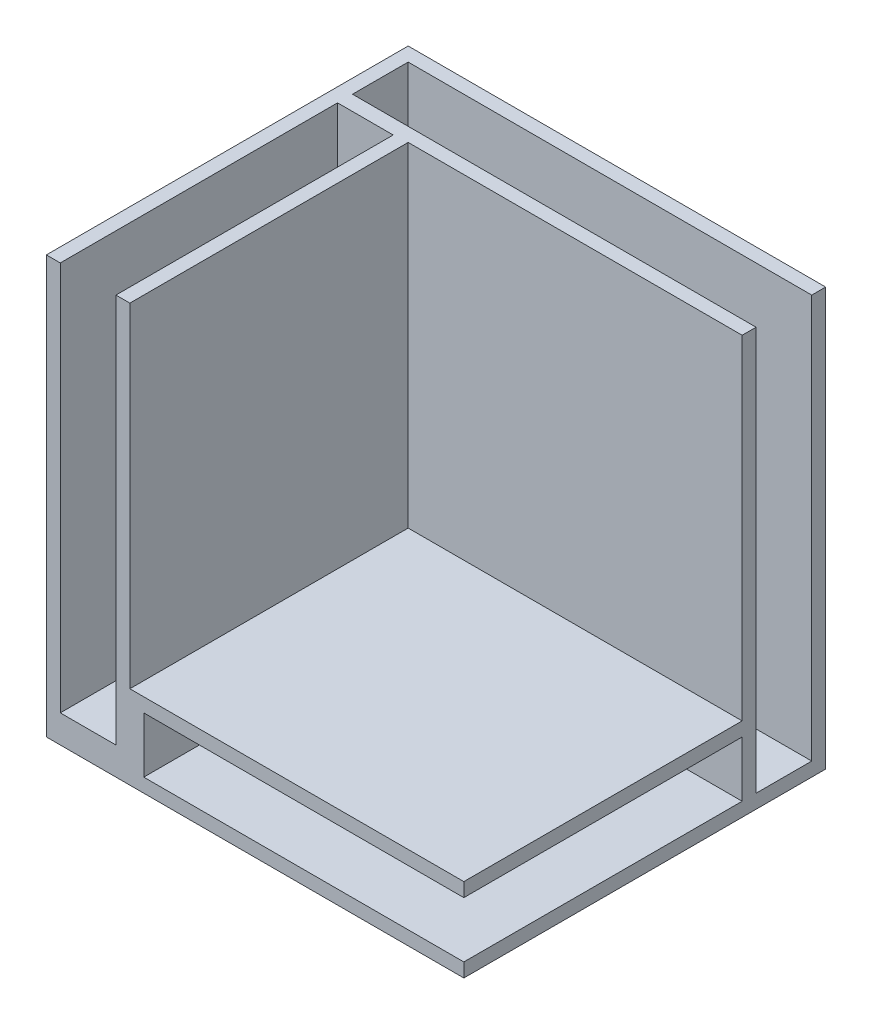
ISO-10303-21;
HEADER;
FILE_DESCRIPTION(('STEP AP214'),'2;1');
FILE_NAME('part.step','',(''),(''),'','','');
FILE_SCHEMA(('AUTOMOTIVE_DESIGN { 1 0 10303 214 1 1 1 1 }'));
ENDSEC;
DATA;
#1=APPLICATION_CONTEXT('core data for automotive mechanical design processes');
#2=APPLICATION_PROTOCOL_DEFINITION('international standard','automotive_design',2000,#1);
#3=PRODUCT_CONTEXT('',#1,'mechanical');
#4=PRODUCT('Part','Part','',(#3));
#5=PRODUCT_RELATED_PRODUCT_CATEGORY('part','',(#4));
#6=PRODUCT_DEFINITION_FORMATION('','',#4);
#7=PRODUCT_DEFINITION_CONTEXT('part definition',#1,'design');
#8=PRODUCT_DEFINITION('design','',#6,#7);
#9=PRODUCT_DEFINITION_SHAPE('','',#8);
#10=(LENGTH_UNIT() NAMED_UNIT(*) SI_UNIT(.MILLI.,.METRE.));
#11=(NAMED_UNIT(*) PLANE_ANGLE_UNIT() SI_UNIT($,.RADIAN.));
#12=(NAMED_UNIT(*) SI_UNIT($,.STERADIAN.) SOLID_ANGLE_UNIT());
#13=UNCERTAINTY_MEASURE_WITH_UNIT(LENGTH_MEASURE(1.E-05),#10,'distance_accuracy_value','');
#14=(GEOMETRIC_REPRESENTATION_CONTEXT(3) GLOBAL_UNCERTAINTY_ASSIGNED_CONTEXT((#13)) GLOBAL_UNIT_ASSIGNED_CONTEXT((#10,
#11,#12)) REPRESENTATION_CONTEXT('',''));
#15=CARTESIAN_POINT('',(0.,0.,0.));
#16=DIRECTION('',(0.,0.,1.));
#17=DIRECTION('',(1.,0.,0.));
#18=AXIS2_PLACEMENT_3D('',#15,#16,#17);
#19=CARTESIAN_POINT('',(5.,0.,26.));
#20=DIRECTION('',(-1.,0.,0.));
#21=DIRECTION('',(0.,0.,1.));
#22=AXIS2_PLACEMENT_3D('',#19,#20,#21);
#23=PLANE('',#22);
#24=DIRECTION('',(0.,1.,0.));
#25=VECTOR('',#24,1.);
#26=CARTESIAN_POINT('',(5.,30.,6.07514362919426));
#27=LINE('',#26,#25);
#28=CARTESIAN_POINT('',(5.,2.,6.07514362919426));
#29=VERTEX_POINT('',#28);
#30=CARTESIAN_POINT('',(5.,30.,6.07514362919426));
#31=VERTEX_POINT('',#30);
#32=EDGE_CURVE('E169',#29,#31,#27,.T.);
#33=ORIENTED_EDGE('',*,*,#32,.F.);
#34=DIRECTION('',(0.,0.,-1.));
#35=VECTOR('',#34,1.);
#36=CARTESIAN_POINT('',(5.,2.,26.));
#37=LINE('',#36,#35);
#38=CARTESIAN_POINT('',(5.,2.,26.));
#39=VERTEX_POINT('',#38);
#40=EDGE_CURVE('E173',#39,#29,#37,.T.);
#41=ORIENTED_EDGE('',*,*,#40,.F.);
#42=DIRECTION('',(0.,1.,0.));
#43=VECTOR('',#42,1.);
#44=CARTESIAN_POINT('',(5.,7.,26.));
#45=LINE('',#44,#43);
#46=CARTESIAN_POINT('',(5.,30.,26.));
#47=VERTEX_POINT('',#46);
#48=EDGE_CURVE('E180',#39,#47,#45,.T.);
#49=ORIENTED_EDGE('',*,*,#48,.T.);
#50=DIRECTION('',(0.,0.,-1.));
#51=VECTOR('',#50,1.);
#52=CARTESIAN_POINT('',(5.,30.,6.));
#53=LINE('',#52,#51);
#54=EDGE_CURVE('E175',#47,#31,#53,.T.);
#55=ORIENTED_EDGE('',*,*,#54,.T.);
#56=EDGE_LOOP('',(#33,#41,#49,#55));
#57=FACE_BOUND('',#56,.T.);
#58=ADVANCED_FACE('F37',(#57),#23,.T.);
#59=CARTESIAN_POINT('',(1.,0.,6.));
#60=DIRECTION('',(1.,0.,0.));
#61=DIRECTION('',(0.,0.,-1.));
#62=AXIS2_PLACEMENT_3D('',#59,#60,#61);
#63=PLANE('',#62);
#64=DIRECTION('',(0.,0.,-1.));
#65=VECTOR('',#64,1.);
#66=CARTESIAN_POINT('',(1.,30.,6.));
#67=LINE('',#66,#65);
#68=CARTESIAN_POINT('',(1.,30.,5.));
#69=VERTEX_POINT('',#68);
#70=CARTESIAN_POINT('',(1.,30.,1.));
#71=VERTEX_POINT('',#70);
#72=EDGE_CURVE('E245',#69,#71,#67,.T.);
#73=ORIENTED_EDGE('',*,*,#72,.F.);
#74=DIRECTION('',(0.,-1.,0.));
#75=VECTOR('',#74,1.);
#76=CARTESIAN_POINT('',(1.,0.,5.));
#77=LINE('',#76,#75);
#78=CARTESIAN_POINT('',(1.,1.,5.));
#79=VERTEX_POINT('',#78);
#80=EDGE_CURVE('E220',#69,#79,#77,.T.);
#81=ORIENTED_EDGE('',*,*,#80,.T.);
#82=DIRECTION('',(0.,0.,-1.));
#83=VECTOR('',#82,1.);
#84=CARTESIAN_POINT('',(1.,1.,6.));
#85=LINE('',#84,#83);
#86=CARTESIAN_POINT('',(1.,1.,1.));
#87=VERTEX_POINT('',#86);
#88=EDGE_CURVE('E231',#79,#87,#85,.T.);
#89=ORIENTED_EDGE('',*,*,#88,.T.);
#90=DIRECTION('',(0.,-1.,0.));
#91=VECTOR('',#90,1.);
#92=CARTESIAN_POINT('',(1.,0.,1.));
#93=LINE('',#92,#91);
#94=EDGE_CURVE('E227',#71,#87,#93,.T.);
#95=ORIENTED_EDGE('',*,*,#94,.F.);
#96=EDGE_LOOP('',(#73,#81,#89,#95));
#97=FACE_BOUND('',#96,.T.);
#98=ADVANCED_FACE('F353',(#97),#63,.T.);
#99=DIRECTION('',(0.,1.,0.));
#100=VECTOR('',#99,1.);
#101=CARTESIAN_POINT('',(1.,0.,6.07514362919426));
#102=LINE('',#101,#100);
#103=CARTESIAN_POINT('',(1.,2.,6.07514362919426));
#104=VERTEX_POINT('',#103);
#105=CARTESIAN_POINT('',(1.,30.,6.07514362919426));
#106=VERTEX_POINT('',#105);
#107=EDGE_CURVE('E11',#104,#106,#102,.T.);
#108=ORIENTED_EDGE('',*,*,#107,.T.);
#109=CARTESIAN_POINT('',(1.,30.,26.));
#110=VERTEX_POINT('',#109);
#111=EDGE_CURVE('E242',#110,#106,#67,.T.);
#112=ORIENTED_EDGE('',*,*,#111,.F.);
#113=DIRECTION('',(0.,-1.,0.));
#114=VECTOR('',#113,1.);
#115=CARTESIAN_POINT('',(1.,7.,26.));
#116=LINE('',#115,#114);
#117=CARTESIAN_POINT('',(1.,2.,26.));
#118=VERTEX_POINT('',#117);
#119=EDGE_CURVE('E206',#110,#118,#116,.T.);
#120=ORIENTED_EDGE('',*,*,#119,.T.);
#121=DIRECTION('',(0.,0.,1.));
#122=VECTOR('',#121,1.);
#123=CARTESIAN_POINT('',(1.,2.,6.07514362919426));
#124=LINE('',#123,#122);
#125=EDGE_CURVE('E188',#104,#118,#124,.T.);
#126=ORIENTED_EDGE('',*,*,#125,.F.);
#127=EDGE_LOOP('',(#108,#112,#120,#126));
#128=FACE_BOUND('',#127,.T.);
#129=ADVANCED_FACE('F374',(#128),#63,.T.);
#130=CARTESIAN_POINT('',(6.,5.,26.));
#131=DIRECTION('',(0.,-1.,0.));
#132=DIRECTION('',(0.,0.,-1.));
#133=AXIS2_PLACEMENT_3D('',#130,#131,#132);
#134=PLANE('',#133);
#135=DIRECTION('',(0.,0.,-1.));
#136=VECTOR('',#135,1.);
#137=CARTESIAN_POINT('',(7.,5.,26.));
#138=LINE('',#137,#136);
#139=CARTESIAN_POINT('',(7.,5.,26.));
#140=VERTEX_POINT('',#139);
#141=CARTESIAN_POINT('',(7.,5.,6.));
#142=VERTEX_POINT('',#141);
#143=EDGE_CURVE('E240',#140,#142,#138,.T.);
#144=ORIENTED_EDGE('',*,*,#143,.T.);
#145=DIRECTION('',(-1.,0.,0.));
#146=VECTOR('',#145,1.);
#147=CARTESIAN_POINT('',(30.,5.,6.));
#148=LINE('',#147,#146);
#149=CARTESIAN_POINT('',(30.,5.,6.));
#150=VERTEX_POINT('',#149);
#151=EDGE_CURVE('E210',#150,#142,#148,.T.);
#152=ORIENTED_EDGE('',*,*,#151,.F.);
#153=DIRECTION('',(0.,0.,-1.));
#154=VECTOR('',#153,1.);
#155=CARTESIAN_POINT('',(30.,5.,26.));
#156=LINE('',#155,#154);
#157=CARTESIAN_POINT('',(30.,5.,26.));
#158=VERTEX_POINT('',#157);
#159=EDGE_CURVE('E219',#158,#150,#156,.T.);
#160=ORIENTED_EDGE('',*,*,#159,.F.);
#161=DIRECTION('',(-1.,0.,0.));
#162=VECTOR('',#161,1.);
#163=CARTESIAN_POINT('',(7.,5.,26.));
#164=LINE('',#163,#162);
#165=EDGE_CURVE('E203',#158,#140,#164,.T.);
#166=ORIENTED_EDGE('',*,*,#165,.T.);
#167=EDGE_LOOP('',(#144,#152,#160,#166));
#168=FACE_BOUND('',#167,.T.);
#169=ADVANCED_FACE('F328',(#168),#134,.T.);
#170=CARTESIAN_POINT('',(0.,1.,6.));
#171=DIRECTION('',(0.,1.,0.));
#172=DIRECTION('',(0.,0.,1.));
#173=AXIS2_PLACEMENT_3D('',#170,#171,#172);
#174=PLANE('',#173);
#175=DIRECTION('',(0.,0.,-1.));
#176=VECTOR('',#175,1.);
#177=CARTESIAN_POINT('',(30.,1.,6.));
#178=LINE('',#177,#176);
#179=CARTESIAN_POINT('',(30.,1.,26.));
#180=VERTEX_POINT('',#179);
#181=CARTESIAN_POINT('',(30.,1.,6.));
#182=VERTEX_POINT('',#181);
#183=EDGE_CURVE('E234',#180,#182,#178,.T.);
#184=ORIENTED_EDGE('',*,*,#183,.T.);
#185=DIRECTION('',(-1.,0.,0.));
#186=VECTOR('',#185,1.);
#187=CARTESIAN_POINT('',(0.,1.,6.));
#188=LINE('',#187,#186);
#189=CARTESIAN_POINT('',(7.,1.,6.));
#190=VERTEX_POINT('',#189);
#191=EDGE_CURVE('E216',#182,#190,#188,.T.);
#192=ORIENTED_EDGE('',*,*,#191,.T.);
#193=DIRECTION('',(0.,0.,-1.));
#194=VECTOR('',#193,1.);
#195=CARTESIAN_POINT('',(7.,1.,6.));
#196=LINE('',#195,#194);
#197=CARTESIAN_POINT('',(7.,1.,26.));
#198=VERTEX_POINT('',#197);
#199=EDGE_CURVE('E238',#198,#190,#196,.T.);
#200=ORIENTED_EDGE('',*,*,#199,.F.);
#201=DIRECTION('',(1.,0.,0.));
#202=VECTOR('',#201,1.);
#203=CARTESIAN_POINT('',(7.,1.,26.));
#204=LINE('',#203,#202);
#205=EDGE_CURVE('E200',#198,#180,#204,.T.);
#206=ORIENTED_EDGE('',*,*,#205,.T.);
#207=EDGE_LOOP('',(#184,#192,#200,#206));
#208=FACE_BOUND('',#207,.T.);
#209=ADVANCED_FACE('F321',(#208),#174,.T.);
#210=DIRECTION('',(1.,0.,0.));
#211=VECTOR('',#210,1.);
#212=CARTESIAN_POINT('',(0.,1.,5.));
#213=LINE('',#212,#211);
#214=CARTESIAN_POINT('',(30.,1.,5.));
#215=VERTEX_POINT('',#214);
#216=EDGE_CURVE('E222',#79,#215,#213,.T.);
#217=ORIENTED_EDGE('',*,*,#216,.T.);
#218=CARTESIAN_POINT('',(30.,1.,1.));
#219=VERTEX_POINT('',#218);
#220=EDGE_CURVE('E244',#215,#219,#178,.T.);
#221=ORIENTED_EDGE('',*,*,#220,.T.);
#222=DIRECTION('',(1.,0.,0.));
#223=VECTOR('',#222,1.);
#224=CARTESIAN_POINT('',(0.,1.,1.));
#225=LINE('',#224,#223);
#226=EDGE_CURVE('E230',#87,#219,#225,.T.);
#227=ORIENTED_EDGE('',*,*,#226,.F.);
#228=ORIENTED_EDGE('',*,*,#88,.F.);
#229=EDGE_LOOP('',(#217,#221,#227,#228));
#230=FACE_BOUND('',#229,.T.);
#231=ADVANCED_FACE('F357',(#230),#174,.T.);
#232=CARTESIAN_POINT('',(7.,6.,26.));
#233=DIRECTION('',(1.,0.,0.));
#234=DIRECTION('',(0.,1.,0.));
#235=AXIS2_PLACEMENT_3D('',#232,#233,#234);
#236=PLANE('',#235);
#237=ORIENTED_EDGE('',*,*,#199,.T.);
#238=DIRECTION('',(0.,1.,0.));
#239=VECTOR('',#238,1.);
#240=CARTESIAN_POINT('',(7.,6.,6.));
#241=LINE('',#240,#239);
#242=EDGE_CURVE('E45',#190,#142,#241,.T.);
#243=ORIENTED_EDGE('',*,*,#242,.T.);
#244=ORIENTED_EDGE('',*,*,#143,.F.);
#245=DIRECTION('',(0.,-1.,0.));
#246=VECTOR('',#245,1.);
#247=CARTESIAN_POINT('',(7.,5.,26.));
#248=LINE('',#247,#246);
#249=EDGE_CURVE('E197',#140,#198,#248,.T.);
#250=ORIENTED_EDGE('',*,*,#249,.T.);
#251=EDGE_LOOP('',(#237,#243,#244,#250));
#252=FACE_BOUND('',#251,.T.);
#253=ADVANCED_FACE('F314',(#252),#236,.T.);
#254=CARTESIAN_POINT('',(30.,0.,6.));
#255=DIRECTION('',(-1.,0.,0.));
#256=DIRECTION('',(0.,0.,1.));
#257=AXIS2_PLACEMENT_3D('',#254,#255,#256);
#258=PLANE('',#257);
#259=DIRECTION('',(0.,1.,0.));
#260=VECTOR('',#259,1.);
#261=CARTESIAN_POINT('',(30.,6.,26.));
#262=LINE('',#261,#260);
#263=CARTESIAN_POINT('',(30.,6.,26.));
#264=VERTEX_POINT('',#263);
#265=EDGE_CURVE('E258',#158,#264,#262,.T.);
#266=ORIENTED_EDGE('',*,*,#265,.F.);
#267=ORIENTED_EDGE('',*,*,#159,.T.);
#268=DIRECTION('',(0.,1.,0.));
#269=VECTOR('',#268,1.);
#270=CARTESIAN_POINT('',(30.,0.,6.));
#271=LINE('',#270,#269);
#272=EDGE_CURVE('E213',#182,#150,#271,.T.);
#273=ORIENTED_EDGE('',*,*,#272,.F.);
#274=ORIENTED_EDGE('',*,*,#183,.F.);
#275=CARTESIAN_POINT('',(30.,0.,26.));
#276=VERTEX_POINT('',#275);
#277=EDGE_CURVE('E259',#276,#180,#262,.T.);
#278=ORIENTED_EDGE('',*,*,#277,.F.);
#279=DIRECTION('',(0.,0.,-1.));
#280=VECTOR('',#279,1.);
#281=CARTESIAN_POINT('',(30.,0.,6.));
#282=LINE('',#281,#280);
#283=CARTESIAN_POINT('',(30.,0.,0.));
#284=VERTEX_POINT('',#283);
#285=EDGE_CURVE('E307',#276,#284,#282,.T.);
#286=ORIENTED_EDGE('',*,*,#285,.T.);
#287=DIRECTION('',(0.,1.,0.));
#288=VECTOR('',#287,1.);
#289=CARTESIAN_POINT('',(30.,0.,0.));
#290=LINE('',#289,#288);
#291=CARTESIAN_POINT('',(30.,30.,0.));
#292=VERTEX_POINT('',#291);
#293=EDGE_CURVE('E298',#284,#292,#290,.T.);
#294=ORIENTED_EDGE('',*,*,#293,.T.);
#295=DIRECTION('',(0.,0.,-1.));
#296=VECTOR('',#295,1.);
#297=CARTESIAN_POINT('',(30.,30.,6.));
#298=LINE('',#297,#296);
#299=CARTESIAN_POINT('',(30.,30.,1.));
#300=VERTEX_POINT('',#299);
#301=EDGE_CURVE('E304',#300,#292,#298,.T.);
#302=ORIENTED_EDGE('',*,*,#301,.F.);
#303=DIRECTION('',(0.,1.,0.));
#304=VECTOR('',#303,1.);
#305=CARTESIAN_POINT('',(30.,0.,1.));
#306=LINE('',#305,#304);
#307=EDGE_CURVE('E237',#219,#300,#306,.T.);
#308=ORIENTED_EDGE('',*,*,#307,.F.);
#309=ORIENTED_EDGE('',*,*,#220,.F.);
#310=DIRECTION('',(0.,1.,0.));
#311=VECTOR('',#310,1.);
#312=CARTESIAN_POINT('',(30.,0.,5.));
#313=LINE('',#312,#311);
#314=CARTESIAN_POINT('',(30.,30.,5.));
#315=VERTEX_POINT('',#314);
#316=EDGE_CURVE('E226',#215,#315,#313,.T.);
#317=ORIENTED_EDGE('',*,*,#316,.T.);
#318=CARTESIAN_POINT('',(30.,30.,6.));
#319=VERTEX_POINT('',#318);
#320=EDGE_CURVE('E305',#319,#315,#298,.T.);
#321=ORIENTED_EDGE('',*,*,#320,.F.);
#322=DIRECTION('',(0.,1.,0.));
#323=VECTOR('',#322,1.);
#324=CARTESIAN_POINT('',(30.,0.,6.));
#325=LINE('',#324,#323);
#326=CARTESIAN_POINT('',(30.,6.,6.));
#327=VERTEX_POINT('',#326);
#328=EDGE_CURVE('E286',#327,#319,#325,.T.);
#329=ORIENTED_EDGE('',*,*,#328,.F.);
#330=DIRECTION('',(0.,0.,-1.));
#331=VECTOR('',#330,1.);
#332=CARTESIAN_POINT('',(30.,6.,26.));
#333=LINE('',#332,#331);
#334=EDGE_CURVE('E268',#264,#327,#333,.T.);
#335=ORIENTED_EDGE('',*,*,#334,.F.);
#336=EDGE_LOOP('',(#266,#267,#273,#274,#278,#286,#294,#302,#308,#309,#317,#321,#329,#335));
#337=FACE_BOUND('',#336,.T.);
#338=ADVANCED_FACE('F326',(#337),#258,.F.);
#339=CARTESIAN_POINT('',(0.,30.,6.));
#340=DIRECTION('',(0.,-1.,0.));
#341=DIRECTION('',(0.,0.,-1.));
#342=AXIS2_PLACEMENT_3D('',#339,#340,#341);
#343=PLANE('',#342);
#344=DIRECTION('',(-1.,0.,0.));
#345=VECTOR('',#344,1.);
#346=CARTESIAN_POINT('',(0.,30.,26.));
#347=LINE('',#346,#345);
#348=CARTESIAN_POINT('',(0.,30.,26.));
#349=VERTEX_POINT('',#348);
#350=EDGE_CURVE('E274',#110,#349,#347,.T.);
#351=ORIENTED_EDGE('',*,*,#350,.F.);
#352=ORIENTED_EDGE('',*,*,#111,.T.);
#353=DIRECTION('',(1.,0.,0.));
#354=VECTOR('',#353,1.);
#355=CARTESIAN_POINT('',(0.,30.,6.07514362919426));
#356=LINE('',#355,#354);
#357=EDGE_CURVE('E179',#106,#31,#356,.T.);
#358=ORIENTED_EDGE('',*,*,#357,.T.);
#359=ORIENTED_EDGE('',*,*,#54,.F.);
#360=CARTESIAN_POINT('',(6.,30.,26.));
#361=VERTEX_POINT('',#360);
#362=EDGE_CURVE('E275',#361,#47,#347,.T.);
#363=ORIENTED_EDGE('',*,*,#362,.F.);
#364=DIRECTION('',(0.,0.,-1.));
#365=VECTOR('',#364,1.);
#366=CARTESIAN_POINT('',(6.,30.,26.));
#367=LINE('',#366,#365);
#368=CARTESIAN_POINT('',(6.,30.,6.));
#369=VERTEX_POINT('',#368);
#370=EDGE_CURVE('E281',#361,#369,#367,.T.);
#371=ORIENTED_EDGE('',*,*,#370,.T.);
#372=DIRECTION('',(-1.,0.,0.));
#373=VECTOR('',#372,1.);
#374=CARTESIAN_POINT('',(0.,30.,6.));
#375=LINE('',#374,#373);
#376=EDGE_CURVE('E288',#319,#369,#375,.T.);
#377=ORIENTED_EDGE('',*,*,#376,.F.);
#378=ORIENTED_EDGE('',*,*,#320,.T.);
#379=DIRECTION('',(-1.,0.,0.));
#380=VECTOR('',#379,1.);
#381=CARTESIAN_POINT('',(0.,30.,5.));
#382=LINE('',#381,#380);
#383=EDGE_CURVE('E52',#315,#69,#382,.T.);
#384=ORIENTED_EDGE('',*,*,#383,.T.);
#385=ORIENTED_EDGE('',*,*,#72,.T.);
#386=DIRECTION('',(-1.,0.,0.));
#387=VECTOR('',#386,1.);
#388=CARTESIAN_POINT('',(0.,30.,1.));
#389=LINE('',#388,#387);
#390=EDGE_CURVE('E223',#300,#71,#389,.T.);
#391=ORIENTED_EDGE('',*,*,#390,.F.);
#392=ORIENTED_EDGE('',*,*,#301,.T.);
#393=DIRECTION('',(-1.,0.,0.));
#394=VECTOR('',#393,1.);
#395=CARTESIAN_POINT('',(0.,30.,0.));
#396=LINE('',#395,#394);
#397=CARTESIAN_POINT('',(0.,30.,0.));
#398=VERTEX_POINT('',#397);
#399=EDGE_CURVE('E289',#292,#398,#396,.T.);
#400=ORIENTED_EDGE('',*,*,#399,.T.);
#401=DIRECTION('',(0.,0.,-1.));
#402=VECTOR('',#401,1.);
#403=CARTESIAN_POINT('',(0.,30.,6.));
#404=LINE('',#403,#402);
#405=EDGE_CURVE('E292',#349,#398,#404,.T.);
#406=ORIENTED_EDGE('',*,*,#405,.F.);
#407=EDGE_LOOP('',(#351,#352,#358,#359,#363,#371,#377,#378,#384,#385,#391,#392,#400,#406));
#408=FACE_BOUND('',#407,.T.);
#409=ADVANCED_FACE('F346',(#408),#343,.F.);
#410=CARTESIAN_POINT('',(0.,0.,6.));
#411=DIRECTION('',(0.,0.,-1.));
#412=DIRECTION('',(-1.,0.,0.));
#413=AXIS2_PLACEMENT_3D('',#410,#411,#412);
#414=PLANE('',#413);
#415=DIRECTION('',(-1.,0.,0.));
#416=VECTOR('',#415,1.);
#417=CARTESIAN_POINT('',(6.,6.,6.));
#418=LINE('',#417,#416);
#419=CARTESIAN_POINT('',(6.,6.,6.));
#420=VERTEX_POINT('',#419);
#421=EDGE_CURVE('E60',#327,#420,#418,.T.);
#422=ORIENTED_EDGE('',*,*,#421,.F.);
#423=ORIENTED_EDGE('',*,*,#328,.T.);
#424=ORIENTED_EDGE('',*,*,#376,.T.);
#425=DIRECTION('',(0.,1.,0.));
#426=VECTOR('',#425,1.);
#427=CARTESIAN_POINT('',(6.,0.,6.));
#428=LINE('',#427,#426);
#429=EDGE_CURVE('E271',#420,#369,#428,.T.);
#430=ORIENTED_EDGE('',*,*,#429,.F.);
#431=EDGE_LOOP('',(#422,#423,#424,#430));
#432=FACE_BOUND('',#431,.T.);
#433=ADVANCED_FACE('F364',(#432),#414,.F.);
#434=CARTESIAN_POINT('',(6.,0.,26.));
#435=DIRECTION('',(-1.,0.,0.));
#436=DIRECTION('',(0.,0.,1.));
#437=AXIS2_PLACEMENT_3D('',#434,#435,#436);
#438=PLANE('',#437);
#439=DIRECTION('',(0.,0.,-1.));
#440=VECTOR('',#439,1.);
#441=CARTESIAN_POINT('',(6.,6.,26.));
#442=LINE('',#441,#440);
#443=CARTESIAN_POINT('',(6.,6.,26.));
#444=VERTEX_POINT('',#443);
#445=EDGE_CURVE('E265',#444,#420,#442,.T.);
#446=ORIENTED_EDGE('',*,*,#445,.T.);
#447=ORIENTED_EDGE('',*,*,#429,.T.);
#448=ORIENTED_EDGE('',*,*,#370,.F.);
#449=DIRECTION('',(0.,1.,0.));
#450=VECTOR('',#449,1.);
#451=CARTESIAN_POINT('',(6.,0.,26.));
#452=LINE('',#451,#450);
#453=EDGE_CURVE('E272',#444,#361,#452,.T.);
#454=ORIENTED_EDGE('',*,*,#453,.F.);
#455=EDGE_LOOP('',(#446,#447,#448,#454));
#456=FACE_BOUND('',#455,.T.);
#457=ADVANCED_FACE('F371',(#456),#438,.F.);
#458=CARTESIAN_POINT('',(0.,0.,6.));
#459=DIRECTION('',(1.,0.,0.));
#460=DIRECTION('',(0.,0.,-1.));
#461=AXIS2_PLACEMENT_3D('',#458,#459,#460);
#462=PLANE('',#461);
#463=ORIENTED_EDGE('',*,*,#405,.T.);
#464=DIRECTION('',(0.,-1.,0.));
#465=VECTOR('',#464,1.);
#466=CARTESIAN_POINT('',(0.,0.,0.));
#467=LINE('',#466,#465);
#468=CARTESIAN_POINT('',(0.,0.,0.));
#469=VERTEX_POINT('',#468);
#470=EDGE_CURVE('E285',#398,#469,#467,.T.);
#471=ORIENTED_EDGE('',*,*,#470,.T.);
#472=DIRECTION('',(0.,0.,-1.));
#473=VECTOR('',#472,1.);
#474=CARTESIAN_POINT('',(0.,0.,6.));
#475=LINE('',#474,#473);
#476=CARTESIAN_POINT('',(0.,0.,26.));
#477=VERTEX_POINT('',#476);
#478=EDGE_CURVE('E309',#477,#469,#475,.T.);
#479=ORIENTED_EDGE('',*,*,#478,.F.);
#480=DIRECTION('',(0.,-1.,0.));
#481=VECTOR('',#480,1.);
#482=CARTESIAN_POINT('',(0.,0.,26.));
#483=LINE('',#482,#481);
#484=EDGE_CURVE('E278',#349,#477,#483,.T.);
#485=ORIENTED_EDGE('',*,*,#484,.F.);
#486=EDGE_LOOP('',(#463,#471,#479,#485));
#487=FACE_BOUND('',#486,.T.);
#488=ADVANCED_FACE('F39',(#487),#462,.F.);
#489=CARTESIAN_POINT('',(0.,0.,6.));
#490=DIRECTION('',(0.,1.,0.));
#491=DIRECTION('',(0.,0.,1.));
#492=AXIS2_PLACEMENT_3D('',#489,#490,#491);
#493=PLANE('',#492);
#494=DIRECTION('',(1.,0.,0.));
#495=VECTOR('',#494,1.);
#496=CARTESIAN_POINT('',(0.,0.,0.));
#497=LINE('',#496,#495);
#498=EDGE_CURVE('E295',#469,#284,#497,.T.);
#499=ORIENTED_EDGE('',*,*,#498,.T.);
#500=ORIENTED_EDGE('',*,*,#285,.F.);
#501=DIRECTION('',(1.,0.,0.));
#502=VECTOR('',#501,1.);
#503=CARTESIAN_POINT('',(6.,0.,26.));
#504=LINE('',#503,#502);
#505=EDGE_CURVE('E255',#477,#276,#504,.T.);
#506=ORIENTED_EDGE('',*,*,#505,.F.);
#507=ORIENTED_EDGE('',*,*,#478,.T.);
#508=EDGE_LOOP('',(#499,#500,#506,#507));
#509=FACE_BOUND('',#508,.T.);
#510=ADVANCED_FACE('F336',(#509),#493,.F.);
#511=CARTESIAN_POINT('',(0.,0.,0.));
#512=DIRECTION('',(0.,0.,-1.));
#513=DIRECTION('',(-1.,0.,0.));
#514=AXIS2_PLACEMENT_3D('',#511,#512,#513);
#515=PLANE('',#514);
#516=ORIENTED_EDGE('',*,*,#470,.F.);
#517=ORIENTED_EDGE('',*,*,#399,.F.);
#518=ORIENTED_EDGE('',*,*,#293,.F.);
#519=ORIENTED_EDGE('',*,*,#498,.F.);
#520=EDGE_LOOP('',(#516,#517,#518,#519));
#521=FACE_BOUND('',#520,.T.);
#522=ADVANCED_FACE('F343',(#521),#515,.T.);
#523=CARTESIAN_POINT('',(0.,0.,26.));
#524=DIRECTION('',(0.,0.,1.));
#525=DIRECTION('',(1.,0.,0.));
#526=AXIS2_PLACEMENT_3D('',#523,#524,#525);
#527=PLANE('',#526);
#528=ORIENTED_EDGE('',*,*,#48,.F.);
#529=DIRECTION('',(1.,0.,0.));
#530=VECTOR('',#529,1.);
#531=CARTESIAN_POINT('',(1.,2.,26.));
#532=LINE('',#531,#530);
#533=EDGE_CURVE('E192',#118,#39,#532,.T.);
#534=ORIENTED_EDGE('',*,*,#533,.F.);
#535=ORIENTED_EDGE('',*,*,#119,.F.);
#536=ORIENTED_EDGE('',*,*,#350,.T.);
#537=ORIENTED_EDGE('',*,*,#484,.T.);
#538=ORIENTED_EDGE('',*,*,#505,.T.);
#539=ORIENTED_EDGE('',*,*,#277,.T.);
#540=ORIENTED_EDGE('',*,*,#205,.F.);
#541=ORIENTED_EDGE('',*,*,#249,.F.);
#542=ORIENTED_EDGE('',*,*,#165,.F.);
#543=ORIENTED_EDGE('',*,*,#265,.T.);
#544=DIRECTION('',(-1.,0.,0.));
#545=VECTOR('',#544,1.);
#546=CARTESIAN_POINT('',(6.,6.,26.));
#547=LINE('',#546,#545);
#548=EDGE_CURVE('E262',#264,#444,#547,.T.);
#549=ORIENTED_EDGE('',*,*,#548,.T.);
#550=ORIENTED_EDGE('',*,*,#453,.T.);
#551=ORIENTED_EDGE('',*,*,#362,.T.);
#552=EDGE_LOOP('',(#528,#534,#535,#536,#537,#538,#539,#540,#541,#542,#543,#549,#550,#551));
#553=FACE_BOUND('',#552,.T.);
#554=ADVANCED_FACE('F332',(#553),#527,.T.);
#555=CARTESIAN_POINT('',(6.,6.,26.));
#556=DIRECTION('',(0.,-1.,0.));
#557=DIRECTION('',(0.,0.,-1.));
#558=AXIS2_PLACEMENT_3D('',#555,#556,#557);
#559=PLANE('',#558);
#560=ORIENTED_EDGE('',*,*,#421,.T.);
#561=ORIENTED_EDGE('',*,*,#445,.F.);
#562=ORIENTED_EDGE('',*,*,#548,.F.);
#563=ORIENTED_EDGE('',*,*,#334,.T.);
#564=EDGE_LOOP('',(#560,#561,#562,#563));
#565=FACE_BOUND('',#564,.T.);
#566=ADVANCED_FACE('F368',(#565),#559,.F.);
#567=CARTESIAN_POINT('',(0.,0.,5.));
#568=DIRECTION('',(0.,0.,-1.));
#569=DIRECTION('',(-1.,0.,0.));
#570=AXIS2_PLACEMENT_3D('',#567,#568,#569);
#571=PLANE('',#570);
#572=ORIENTED_EDGE('',*,*,#80,.F.);
#573=ORIENTED_EDGE('',*,*,#383,.F.);
#574=ORIENTED_EDGE('',*,*,#316,.F.);
#575=ORIENTED_EDGE('',*,*,#216,.F.);
#576=EDGE_LOOP('',(#572,#573,#574,#575));
#577=FACE_BOUND('',#576,.T.);
#578=ADVANCED_FACE('F388',(#577),#571,.T.);
#579=CARTESIAN_POINT('',(0.,0.,1.));
#580=DIRECTION('',(0.,0.,-1.));
#581=DIRECTION('',(-1.,0.,0.));
#582=AXIS2_PLACEMENT_3D('',#579,#580,#581);
#583=PLANE('',#582);
#584=ORIENTED_EDGE('',*,*,#94,.T.);
#585=ORIENTED_EDGE('',*,*,#226,.T.);
#586=ORIENTED_EDGE('',*,*,#307,.T.);
#587=ORIENTED_EDGE('',*,*,#390,.T.);
#588=EDGE_LOOP('',(#584,#585,#586,#587));
#589=FACE_BOUND('',#588,.T.);
#590=ADVANCED_FACE('F351',(#589),#583,.F.);
#591=CARTESIAN_POINT('',(30.,0.,6.));
#592=DIRECTION('',(0.,0.,-1.));
#593=DIRECTION('',(-1.,0.,0.));
#594=AXIS2_PLACEMENT_3D('',#591,#592,#593);
#595=PLANE('',#594);
#596=ORIENTED_EDGE('',*,*,#191,.F.);
#597=ORIENTED_EDGE('',*,*,#272,.T.);
#598=ORIENTED_EDGE('',*,*,#151,.T.);
#599=ORIENTED_EDGE('',*,*,#242,.F.);
#600=EDGE_LOOP('',(#596,#597,#598,#599));
#601=FACE_BOUND('',#600,.T.);
#602=ADVANCED_FACE('F317',(#601),#595,.F.);
#603=CARTESIAN_POINT('',(0.,30.,6.07514362919426));
#604=DIRECTION('',(0.,0.,-1.));
#605=DIRECTION('',(0.,1.,0.));
#606=AXIS2_PLACEMENT_3D('',#603,#604,#605);
#607=PLANE('',#606);
#608=ORIENTED_EDGE('',*,*,#107,.F.);
#609=DIRECTION('',(-1.,0.,0.));
#610=VECTOR('',#609,1.);
#611=CARTESIAN_POINT('',(5.,2.,6.07514362919426));
#612=LINE('',#611,#610);
#613=EDGE_CURVE('E183',#29,#104,#612,.T.);
#614=ORIENTED_EDGE('',*,*,#613,.F.);
#615=ORIENTED_EDGE('',*,*,#32,.T.);
#616=ORIENTED_EDGE('',*,*,#357,.F.);
#617=EDGE_LOOP('',(#608,#614,#615,#616));
#618=FACE_BOUND('',#617,.T.);
#619=ADVANCED_FACE('F184',(#618),#607,.F.);
#620=CARTESIAN_POINT('',(0.,2.,0.));
#621=DIRECTION('',(0.,1.,0.));
#622=DIRECTION('',(-1.,0.,0.));
#623=AXIS2_PLACEMENT_3D('',#620,#621,#622);
#624=PLANE('',#623);
#625=ORIENTED_EDGE('',*,*,#40,.T.);
#626=ORIENTED_EDGE('',*,*,#613,.T.);
#627=ORIENTED_EDGE('',*,*,#125,.T.);
#628=ORIENTED_EDGE('',*,*,#533,.T.);
#629=EDGE_LOOP('',(#625,#626,#627,#628));
#630=FACE_BOUND('',#629,.T.);
#631=ADVANCED_FACE('F190',(#630),#624,.T.);
#632=CLOSED_SHELL('',(#58,#98,#129,#169,#209,#231,#253,#338,#409,#433,#457,#488,#510,#522,#554,
#566,#578,#590,#602,#619,#631));
#633=MANIFOLD_SOLID_BREP('B2',#632);
#634=ADVANCED_BREP_SHAPE_REPRESENTATION('',(#18,#633),#14);
#635=SHAPE_DEFINITION_REPRESENTATION(#9,#634);
ENDSEC;
END-ISO-10303-21;
